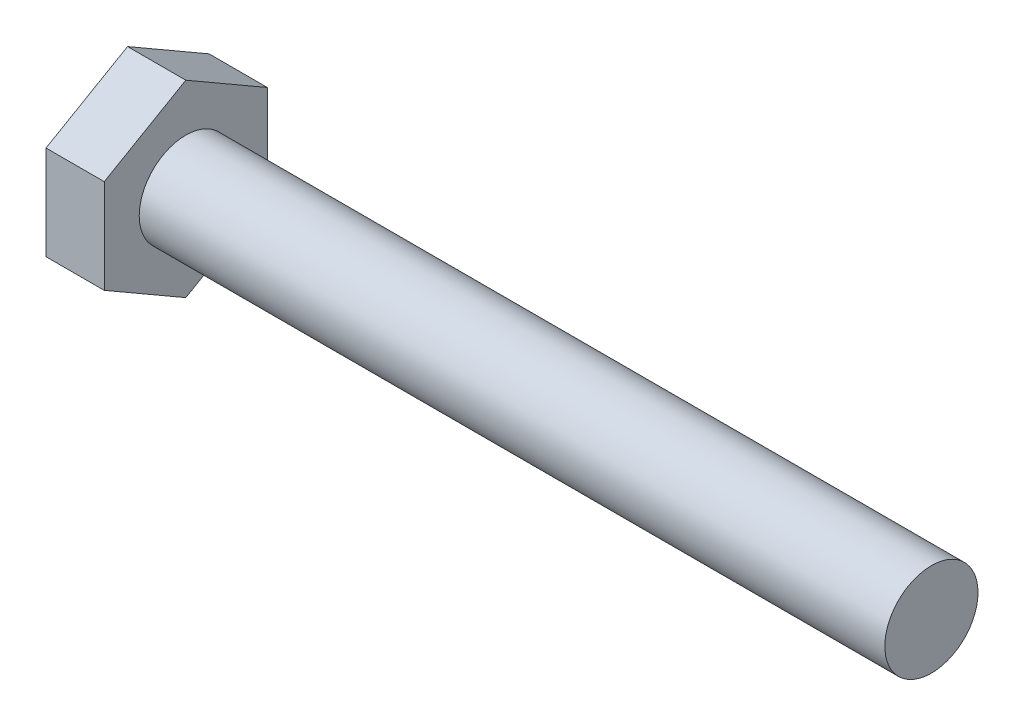
ISO-10303-21;
HEADER;
FILE_DESCRIPTION(('STEP AP214'),'2;1');
FILE_NAME('part.step','',(''),(''),'','','');
FILE_SCHEMA(('AUTOMOTIVE_DESIGN { 1 0 10303 214 1 1 1 1 }'));
ENDSEC;
DATA;
#1=APPLICATION_CONTEXT('core data for automotive mechanical design processes');
#2=APPLICATION_PROTOCOL_DEFINITION('international standard','automotive_design',2000,#1);
#3=PRODUCT_CONTEXT('',#1,'mechanical');
#4=PRODUCT('Part','Part','',(#3));
#5=PRODUCT_RELATED_PRODUCT_CATEGORY('part','',(#4));
#6=PRODUCT_DEFINITION_FORMATION('','',#4);
#7=PRODUCT_DEFINITION_CONTEXT('part definition',#1,'design');
#8=PRODUCT_DEFINITION('design','',#6,#7);
#9=PRODUCT_DEFINITION_SHAPE('','',#8);
#10=(LENGTH_UNIT() NAMED_UNIT(*) SI_UNIT(.MILLI.,.METRE.));
#11=(NAMED_UNIT(*) PLANE_ANGLE_UNIT() SI_UNIT($,.RADIAN.));
#12=(NAMED_UNIT(*) SI_UNIT($,.STERADIAN.) SOLID_ANGLE_UNIT());
#13=UNCERTAINTY_MEASURE_WITH_UNIT(LENGTH_MEASURE(1.E-05),#10,'distance_accuracy_value','');
#14=(GEOMETRIC_REPRESENTATION_CONTEXT(3) GLOBAL_UNCERTAINTY_ASSIGNED_CONTEXT((#13)) GLOBAL_UNIT_ASSIGNED_CONTEXT((#10,
#11,#12)) REPRESENTATION_CONTEXT('',''));
#15=CARTESIAN_POINT('',(0.,0.,0.));
#16=DIRECTION('',(0.,0.,1.));
#17=DIRECTION('',(1.,0.,0.));
#18=AXIS2_PLACEMENT_3D('',#15,#16,#17);
#19=CARTESIAN_POINT('',(-23.415625,0.,0.));
#20=DIRECTION('',(1.,0.,0.));
#21=DIRECTION('',(0.,0.,-1.));
#22=AXIS2_PLACEMENT_3D('',#19,#20,#21);
#23=CYLINDRICAL_SURFACE('',#22,3.175);
#24=CARTESIAN_POINT('',(-23.415625,0.,0.));
#25=DIRECTION('',(-1.,0.,0.));
#26=DIRECTION('',(0.,0.,1.));
#27=AXIS2_PLACEMENT_3D('',#24,#25,#26);
#28=CIRCLE('',#27,3.175);
#29=CARTESIAN_POINT('',(-23.415625,0.,3.175));
#30=VERTEX_POINT('',#29);
#31=EDGE_CURVE('E53',#30,#30,#28,.F.);
#32=ORIENTED_EDGE('',*,*,#31,.T.);
#33=EDGE_LOOP('',(#32));
#34=FACE_BOUND('',#33,.T.);
#35=CARTESIAN_POINT('',(27.384375,0.,0.));
#36=DIRECTION('',(1.,0.,0.));
#37=DIRECTION('',(0.,0.,-1.));
#38=AXIS2_PLACEMENT_3D('',#35,#36,#37);
#39=CIRCLE('',#38,3.175);
#40=CARTESIAN_POINT('',(27.384375,0.,-3.175));
#41=VERTEX_POINT('',#40);
#42=EDGE_CURVE('E11',#41,#41,#39,.T.);
#43=ORIENTED_EDGE('',*,*,#42,.F.);
#44=EDGE_LOOP('',(#43));
#45=FACE_BOUND('',#44,.T.);
#46=ADVANCED_FACE('F45',(#34,#45),#23,.T.);
#47=CARTESIAN_POINT('',(27.384375,0.,0.));
#48=DIRECTION('',(1.,0.,0.));
#49=DIRECTION('',(0.,0.,-1.));
#50=AXIS2_PLACEMENT_3D('',#47,#48,#49);
#51=PLANE('',#50);
#52=ORIENTED_EDGE('',*,*,#42,.T.);
#53=EDGE_LOOP('',(#52));
#54=FACE_BOUND('',#53,.T.);
#55=ADVANCED_FACE('F173',(#54),#51,.T.);
#56=CARTESIAN_POINT('',(-27.384375,-3.20790243318485,5.55625));
#57=DIRECTION('',(0.,0.,-1.));
#58=DIRECTION('',(-1.,0.,0.));
#59=AXIS2_PLACEMENT_3D('',#56,#57,#58);
#60=PLANE('',#59);
#61=DIRECTION('',(0.,1.,0.));
#62=VECTOR('',#61,1.);
#63=CARTESIAN_POINT('',(-23.415625,-3.20790243318485,5.55625));
#64=LINE('',#63,#62);
#65=CARTESIAN_POINT('',(-23.415625,-3.20790243318485,5.55625));
#66=VERTEX_POINT('',#65);
#67=CARTESIAN_POINT('',(-23.415625,3.20790243318486,5.55625));
#68=VERTEX_POINT('',#67);
#69=EDGE_CURVE('E130',#66,#68,#64,.T.);
#70=ORIENTED_EDGE('',*,*,#69,.T.);
#71=DIRECTION('',(1.,0.,0.));
#72=VECTOR('',#71,1.);
#73=CARTESIAN_POINT('',(-27.384375,3.20790243318486,5.55625));
#74=LINE('',#73,#72);
#75=CARTESIAN_POINT('',(-27.384375,3.20790243318486,5.55625));
#76=VERTEX_POINT('',#75);
#77=EDGE_CURVE('E147',#76,#68,#74,.T.);
#78=ORIENTED_EDGE('',*,*,#77,.F.);
#79=DIRECTION('',(0.,1.,0.));
#80=VECTOR('',#79,1.);
#81=CARTESIAN_POINT('',(-27.384375,-3.20790243318485,5.55625));
#82=LINE('',#81,#80);
#83=CARTESIAN_POINT('',(-27.384375,-3.20790243318485,5.55625));
#84=VERTEX_POINT('',#83);
#85=EDGE_CURVE('E140',#84,#76,#82,.T.);
#86=ORIENTED_EDGE('',*,*,#85,.F.);
#87=DIRECTION('',(1.,0.,0.));
#88=VECTOR('',#87,1.);
#89=CARTESIAN_POINT('',(-27.384375,-3.20790243318485,5.55625));
#90=LINE('',#89,#88);
#91=EDGE_CURVE('E126',#84,#66,#90,.T.);
#92=ORIENTED_EDGE('',*,*,#91,.T.);
#93=EDGE_LOOP('',(#70,#78,#86,#92));
#94=FACE_BOUND('',#93,.T.);
#95=ADVANCED_FACE('F161',(#94),#60,.F.);
#96=CARTESIAN_POINT('',(-27.384375,3.20790243318486,5.55625));
#97=DIRECTION('',(0.,-0.866025403784438,-0.5));
#98=DIRECTION('',(0.,0.5,-0.866025403784439));
#99=AXIS2_PLACEMENT_3D('',#96,#97,#98);
#100=PLANE('',#99);
#101=DIRECTION('',(0.,0.5,-0.866025403784438));
#102=VECTOR('',#101,1.);
#103=CARTESIAN_POINT('',(-23.415625,3.20790243318486,5.55625));
#104=LINE('',#103,#102);
#105=CARTESIAN_POINT('',(-23.415625,6.41580486636972,0.));
#106=VERTEX_POINT('',#105);
#107=EDGE_CURVE('E133',#68,#106,#104,.T.);
#108=ORIENTED_EDGE('',*,*,#107,.T.);
#109=DIRECTION('',(1.,0.,0.));
#110=VECTOR('',#109,1.);
#111=CARTESIAN_POINT('',(-27.384375,6.41580486636972,0.));
#112=LINE('',#111,#110);
#113=CARTESIAN_POINT('',(-27.384375,6.41580486636972,0.));
#114=VERTEX_POINT('',#113);
#115=EDGE_CURVE('E144',#114,#106,#112,.T.);
#116=ORIENTED_EDGE('',*,*,#115,.F.);
#117=DIRECTION('',(0.,0.5,-0.866025403784438));
#118=VECTOR('',#117,1.);
#119=CARTESIAN_POINT('',(-27.384375,3.20790243318486,5.55625));
#120=LINE('',#119,#118);
#121=EDGE_CURVE('E99',#76,#114,#120,.T.);
#122=ORIENTED_EDGE('',*,*,#121,.F.);
#123=ORIENTED_EDGE('',*,*,#77,.T.);
#124=EDGE_LOOP('',(#108,#116,#122,#123));
#125=FACE_BOUND('',#124,.T.);
#126=ADVANCED_FACE('F181',(#125),#100,.F.);
#127=CARTESIAN_POINT('',(-27.384375,6.41580486636972,0.));
#128=DIRECTION('',(0.,-0.866025403784439,0.5));
#129=DIRECTION('',(0.,-0.5,-0.866025403784439));
#130=AXIS2_PLACEMENT_3D('',#127,#128,#129);
#131=PLANE('',#130);
#132=DIRECTION('',(0.,-0.5,-0.866025403784439));
#133=VECTOR('',#132,1.);
#134=CARTESIAN_POINT('',(-23.415625,6.41580486636972,0.));
#135=LINE('',#134,#133);
#136=CARTESIAN_POINT('',(-23.415625,3.20790243318486,-5.55625));
#137=VERTEX_POINT('',#136);
#138=EDGE_CURVE('E135',#106,#137,#135,.T.);
#139=ORIENTED_EDGE('',*,*,#138,.T.);
#140=DIRECTION('',(1.,0.,0.));
#141=VECTOR('',#140,1.);
#142=CARTESIAN_POINT('',(-27.384375,3.20790243318486,-5.55625));
#143=LINE('',#142,#141);
#144=CARTESIAN_POINT('',(-27.384375,3.20790243318486,-5.55625));
#145=VERTEX_POINT('',#144);
#146=EDGE_CURVE('E121',#145,#137,#143,.T.);
#147=ORIENTED_EDGE('',*,*,#146,.F.);
#148=DIRECTION('',(0.,-0.5,-0.866025403784439));
#149=VECTOR('',#148,1.);
#150=CARTESIAN_POINT('',(-27.384375,6.41580486636972,0.));
#151=LINE('',#150,#149);
#152=EDGE_CURVE('E112',#114,#145,#151,.T.);
#153=ORIENTED_EDGE('',*,*,#152,.F.);
#154=ORIENTED_EDGE('',*,*,#115,.T.);
#155=EDGE_LOOP('',(#139,#147,#153,#154));
#156=FACE_BOUND('',#155,.T.);
#157=ADVANCED_FACE('F186',(#156),#131,.F.);
#158=CARTESIAN_POINT('',(-27.384375,3.20790243318486,-5.55625));
#159=DIRECTION('',(0.,0.,1.));
#160=DIRECTION('',(1.,0.,0.));
#161=AXIS2_PLACEMENT_3D('',#158,#159,#160);
#162=PLANE('',#161);
#163=DIRECTION('',(0.,-1.,0.));
#164=VECTOR('',#163,1.);
#165=CARTESIAN_POINT('',(-23.415625,3.20790243318486,-5.55625));
#166=LINE('',#165,#164);
#167=CARTESIAN_POINT('',(-23.415625,-3.20790243318486,-5.55625));
#168=VERTEX_POINT('',#167);
#169=EDGE_CURVE('E120',#137,#168,#166,.T.);
#170=ORIENTED_EDGE('',*,*,#169,.T.);
#171=DIRECTION('',(1.,0.,0.));
#172=VECTOR('',#171,1.);
#173=CARTESIAN_POINT('',(-27.384375,-3.20790243318486,-5.55625));
#174=LINE('',#173,#172);
#175=CARTESIAN_POINT('',(-27.384375,-3.20790243318486,-5.55625));
#176=VERTEX_POINT('',#175);
#177=EDGE_CURVE('E117',#176,#168,#174,.T.);
#178=ORIENTED_EDGE('',*,*,#177,.F.);
#179=DIRECTION('',(0.,-1.,0.));
#180=VECTOR('',#179,1.);
#181=CARTESIAN_POINT('',(-27.384375,3.20790243318486,-5.55625));
#182=LINE('',#181,#180);
#183=EDGE_CURVE('E106',#145,#176,#182,.T.);
#184=ORIENTED_EDGE('',*,*,#183,.F.);
#185=ORIENTED_EDGE('',*,*,#146,.T.);
#186=EDGE_LOOP('',(#170,#178,#184,#185));
#187=FACE_BOUND('',#186,.T.);
#188=ADVANCED_FACE('F118',(#187),#162,.F.);
#189=CARTESIAN_POINT('',(-27.384375,-3.20790243318486,-5.55625));
#190=DIRECTION('',(0.,0.866025403784439,0.5));
#191=DIRECTION('',(0.,-0.5,0.866025403784439));
#192=AXIS2_PLACEMENT_3D('',#189,#190,#191);
#193=PLANE('',#192);
#194=DIRECTION('',(0.,-0.5,0.866025403784439));
#195=VECTOR('',#194,1.);
#196=CARTESIAN_POINT('',(-23.415625,-3.20790243318486,-5.55625));
#197=LINE('',#196,#195);
#198=CARTESIAN_POINT('',(-23.415625,-6.41580486636971,0.));
#199=VERTEX_POINT('',#198);
#200=EDGE_CURVE('E84',#168,#199,#197,.T.);
#201=ORIENTED_EDGE('',*,*,#200,.T.);
#202=DIRECTION('',(1.,0.,0.));
#203=VECTOR('',#202,1.);
#204=CARTESIAN_POINT('',(-27.384375,-6.41580486636971,0.));
#205=LINE('',#204,#203);
#206=CARTESIAN_POINT('',(-27.384375,-6.41580486636971,0.));
#207=VERTEX_POINT('',#206);
#208=EDGE_CURVE('E122',#207,#199,#205,.T.);
#209=ORIENTED_EDGE('',*,*,#208,.F.);
#210=DIRECTION('',(0.,-0.5,0.866025403784439));
#211=VECTOR('',#210,1.);
#212=CARTESIAN_POINT('',(-27.384375,-3.20790243318486,-5.55625));
#213=LINE('',#212,#211);
#214=EDGE_CURVE('E110',#176,#207,#213,.T.);
#215=ORIENTED_EDGE('',*,*,#214,.F.);
#216=ORIENTED_EDGE('',*,*,#177,.T.);
#217=EDGE_LOOP('',(#201,#209,#215,#216));
#218=FACE_BOUND('',#217,.T.);
#219=ADVANCED_FACE('F124',(#218),#193,.F.);
#220=CARTESIAN_POINT('',(-27.384375,-6.41580486636971,0.));
#221=DIRECTION('',(0.,0.866025403784439,-0.5));
#222=DIRECTION('',(0.,0.5,0.866025403784439));
#223=AXIS2_PLACEMENT_3D('',#220,#221,#222);
#224=PLANE('',#223);
#225=DIRECTION('',(0.,0.5,0.866025403784439));
#226=VECTOR('',#225,1.);
#227=CARTESIAN_POINT('',(-23.415625,-6.41580486636971,0.));
#228=LINE('',#227,#226);
#229=EDGE_CURVE('E90',#199,#66,#228,.T.);
#230=ORIENTED_EDGE('',*,*,#229,.T.);
#231=ORIENTED_EDGE('',*,*,#91,.F.);
#232=DIRECTION('',(0.,0.5,0.866025403784439));
#233=VECTOR('',#232,1.);
#234=CARTESIAN_POINT('',(-27.384375,-6.41580486636971,0.));
#235=LINE('',#234,#233);
#236=EDGE_CURVE('E61',#207,#84,#235,.T.);
#237=ORIENTED_EDGE('',*,*,#236,.F.);
#238=ORIENTED_EDGE('',*,*,#208,.T.);
#239=EDGE_LOOP('',(#230,#231,#237,#238));
#240=FACE_BOUND('',#239,.T.);
#241=ADVANCED_FACE('F163',(#240),#224,.F.);
#242=CARTESIAN_POINT('',(-27.384375,3.20790243318486,5.55625));
#243=DIRECTION('',(-1.,0.,0.));
#244=DIRECTION('',(0.,0.,1.));
#245=AXIS2_PLACEMENT_3D('',#242,#243,#244);
#246=PLANE('',#245);
#247=ORIENTED_EDGE('',*,*,#85,.T.);
#248=ORIENTED_EDGE('',*,*,#121,.T.);
#249=ORIENTED_EDGE('',*,*,#152,.T.);
#250=ORIENTED_EDGE('',*,*,#183,.T.);
#251=ORIENTED_EDGE('',*,*,#214,.T.);
#252=ORIENTED_EDGE('',*,*,#236,.T.);
#253=EDGE_LOOP('',(#247,#248,#249,#250,#251,#252));
#254=FACE_BOUND('',#253,.T.);
#255=ADVANCED_FACE('F108',(#254),#246,.T.);
#256=CARTESIAN_POINT('',(-23.415625,3.20790243318486,5.55625));
#257=DIRECTION('',(-1.,0.,0.));
#258=DIRECTION('',(0.,0.,1.));
#259=AXIS2_PLACEMENT_3D('',#256,#257,#258);
#260=PLANE('',#259);
#261=ORIENTED_EDGE('',*,*,#31,.F.);
#262=EDGE_LOOP('',(#261));
#263=FACE_BOUND('',#262,.T.);
#264=ORIENTED_EDGE('',*,*,#69,.F.);
#265=ORIENTED_EDGE('',*,*,#229,.F.);
#266=ORIENTED_EDGE('',*,*,#200,.F.);
#267=ORIENTED_EDGE('',*,*,#169,.F.);
#268=ORIENTED_EDGE('',*,*,#138,.F.);
#269=ORIENTED_EDGE('',*,*,#107,.F.);
#270=EDGE_LOOP('',(#264,#265,#266,#267,#268,#269));
#271=FACE_BOUND('',#270,.T.);
#272=ADVANCED_FACE('F153',(#263,#271),#260,.F.);
#273=CLOSED_SHELL('',(#46,#55,#95,#126,#157,#188,#219,#241,#255,#272));
#274=MANIFOLD_SOLID_BREP('B2',#273);
#275=ADVANCED_BREP_SHAPE_REPRESENTATION('',(#18,#274),#14);
#276=SHAPE_DEFINITION_REPRESENTATION(#9,#275);
ENDSEC;
END-ISO-10303-21;
